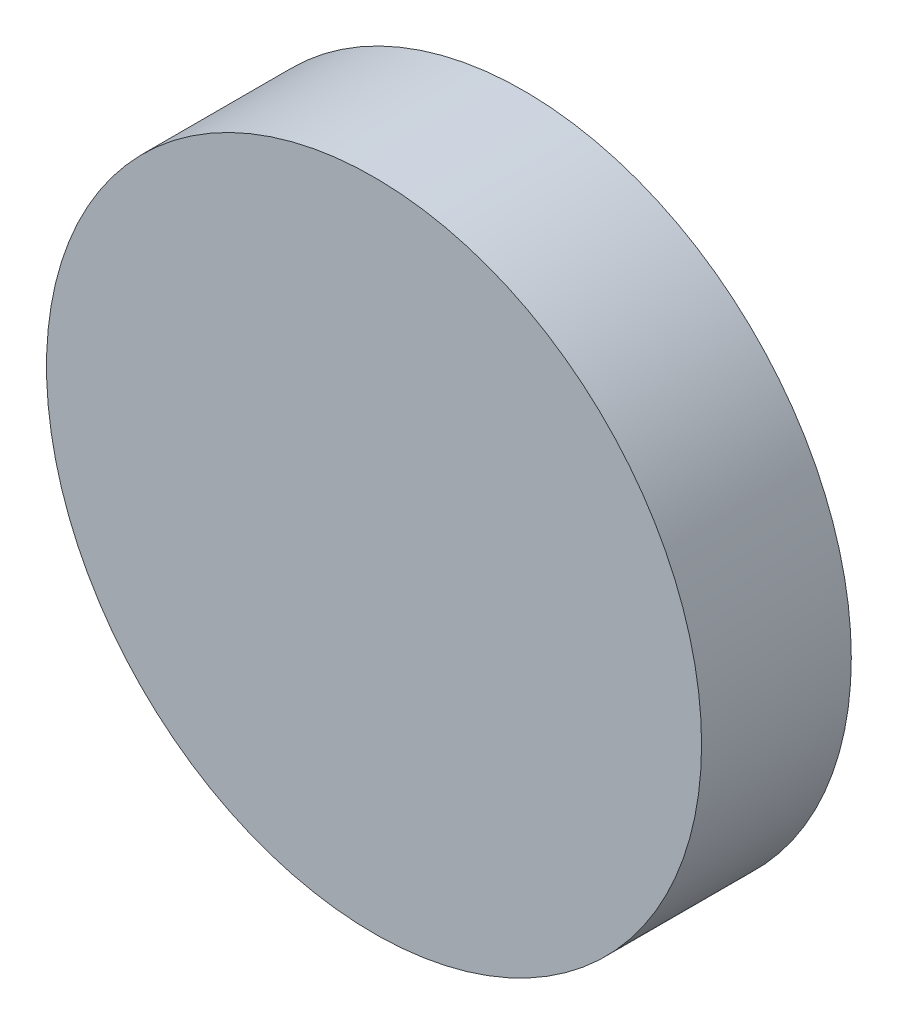
ISO-10303-21;
HEADER;
FILE_DESCRIPTION(('STEP AP214'),'2;1');
FILE_NAME('part.step','',(''),(''),'','','');
FILE_SCHEMA(('AUTOMOTIVE_DESIGN { 1 0 10303 214 1 1 1 1 }'));
ENDSEC;
DATA;
#1=APPLICATION_CONTEXT('core data for automotive mechanical design processes');
#2=APPLICATION_PROTOCOL_DEFINITION('international standard','automotive_design',2000,#1);
#3=PRODUCT_CONTEXT('',#1,'mechanical');
#4=PRODUCT('Part','Part','',(#3));
#5=PRODUCT_RELATED_PRODUCT_CATEGORY('part','',(#4));
#6=PRODUCT_DEFINITION_FORMATION('','',#4);
#7=PRODUCT_DEFINITION_CONTEXT('part definition',#1,'design');
#8=PRODUCT_DEFINITION('design','',#6,#7);
#9=PRODUCT_DEFINITION_SHAPE('','',#8);
#10=(LENGTH_UNIT() NAMED_UNIT(*) SI_UNIT(.MILLI.,.METRE.));
#11=(NAMED_UNIT(*) PLANE_ANGLE_UNIT() SI_UNIT($,.RADIAN.));
#12=(NAMED_UNIT(*) SI_UNIT($,.STERADIAN.) SOLID_ANGLE_UNIT());
#13=UNCERTAINTY_MEASURE_WITH_UNIT(LENGTH_MEASURE(1.E-05),#10,'distance_accuracy_value','');
#14=(GEOMETRIC_REPRESENTATION_CONTEXT(3) GLOBAL_UNCERTAINTY_ASSIGNED_CONTEXT((#13)) GLOBAL_UNIT_ASSIGNED_CONTEXT((#10,
#11,#12)) REPRESENTATION_CONTEXT('',''));
#15=CARTESIAN_POINT('',(0.,0.,0.));
#16=DIRECTION('',(0.,0.,1.));
#17=DIRECTION('',(1.,0.,0.));
#18=AXIS2_PLACEMENT_3D('',#15,#16,#17);
#19=CARTESIAN_POINT('',(0.,0.,80.));
#20=DIRECTION('',(0.,0.,-1.));
#21=DIRECTION('',(-1.,0.,0.));
#22=AXIS2_PLACEMENT_3D('',#19,#20,#21);
#23=CYLINDRICAL_SURFACE('',#22,175.);
#24=CARTESIAN_POINT('',(0.,0.,80.));
#25=DIRECTION('',(0.,0.,1.));
#26=DIRECTION('',(1.,0.,0.));
#27=AXIS2_PLACEMENT_3D('',#24,#25,#26);
#28=CIRCLE('',#27,175.);
#29=CARTESIAN_POINT('',(175.,0.,80.));
#30=VERTEX_POINT('',#29);
#31=EDGE_CURVE('E10',#30,#30,#28,.T.);
#32=ORIENTED_EDGE('',*,*,#31,.F.);
#33=EDGE_LOOP('',(#32));
#34=FACE_BOUND('',#33,.T.);
#35=CARTESIAN_POINT('',(0.,0.,0.));
#36=DIRECTION('',(0.,0.,1.));
#37=DIRECTION('',(1.,0.,0.));
#38=AXIS2_PLACEMENT_3D('',#35,#36,#37);
#39=CIRCLE('',#38,175.);
#40=CARTESIAN_POINT('',(175.,0.,0.));
#41=VERTEX_POINT('',#40);
#42=EDGE_CURVE('E46',#41,#41,#39,.T.);
#43=ORIENTED_EDGE('',*,*,#42,.T.);
#44=EDGE_LOOP('',(#43));
#45=FACE_BOUND('',#44,.T.);
#46=ADVANCED_FACE('F43',(#34,#45),#23,.T.);
#47=CARTESIAN_POINT('',(0.,0.,80.));
#48=DIRECTION('',(0.,0.,1.));
#49=DIRECTION('',(1.,0.,0.));
#50=AXIS2_PLACEMENT_3D('',#47,#48,#49);
#51=PLANE('',#50);
#52=ORIENTED_EDGE('',*,*,#31,.T.);
#53=EDGE_LOOP('',(#52));
#54=FACE_BOUND('',#53,.T.);
#55=ADVANCED_FACE('F60',(#54),#51,.T.);
#56=CARTESIAN_POINT('',(0.,0.,0.));
#57=DIRECTION('',(0.,0.,1.));
#58=DIRECTION('',(1.,0.,0.));
#59=AXIS2_PLACEMENT_3D('',#56,#57,#58);
#60=PLANE('',#59);
#61=ORIENTED_EDGE('',*,*,#42,.F.);
#62=EDGE_LOOP('',(#61));
#63=FACE_BOUND('',#62,.T.);
#64=ADVANCED_FACE('F58',(#63),#60,.F.);
#65=CLOSED_SHELL('',(#46,#55,#64));
#66=MANIFOLD_SOLID_BREP('B2',#65);
#67=ADVANCED_BREP_SHAPE_REPRESENTATION('',(#18,#66),#14);
#68=SHAPE_DEFINITION_REPRESENTATION(#9,#67);
ENDSEC;
END-ISO-10303-21;
